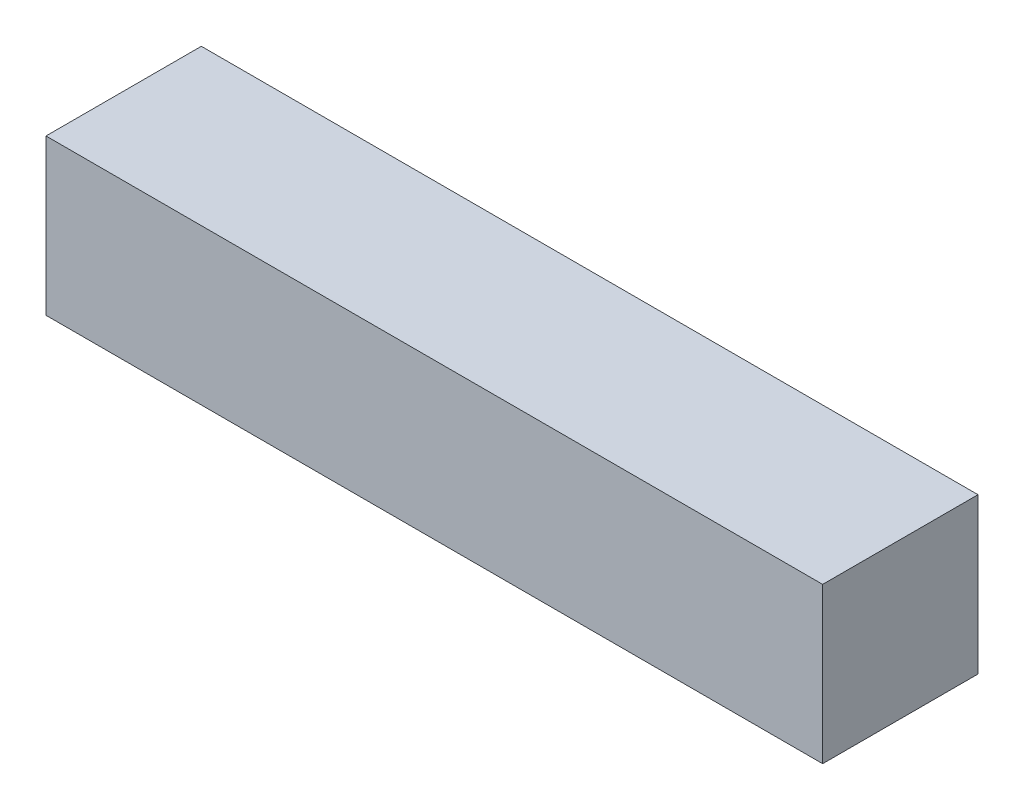
ISO-10303-21;
HEADER;
FILE_DESCRIPTION(('STEP AP214'),'2;1');
FILE_NAME('part.step','',(''),(''),'','','');
FILE_SCHEMA(('AUTOMOTIVE_DESIGN { 1 0 10303 214 1 1 1 1 }'));
ENDSEC;
DATA;
#1=APPLICATION_CONTEXT('core data for automotive mechanical design processes');
#2=APPLICATION_PROTOCOL_DEFINITION('international standard','automotive_design',2000,#1);
#3=PRODUCT_CONTEXT('',#1,'mechanical');
#4=PRODUCT('Part','Part','',(#3));
#5=PRODUCT_RELATED_PRODUCT_CATEGORY('part','',(#4));
#6=PRODUCT_DEFINITION_FORMATION('','',#4);
#7=PRODUCT_DEFINITION_CONTEXT('part definition',#1,'design');
#8=PRODUCT_DEFINITION('design','',#6,#7);
#9=PRODUCT_DEFINITION_SHAPE('','',#8);
#10=(LENGTH_UNIT() NAMED_UNIT(*) SI_UNIT(.MILLI.,.METRE.));
#11=(NAMED_UNIT(*) PLANE_ANGLE_UNIT() SI_UNIT($,.RADIAN.));
#12=(NAMED_UNIT(*) SI_UNIT($,.STERADIAN.) SOLID_ANGLE_UNIT());
#13=UNCERTAINTY_MEASURE_WITH_UNIT(LENGTH_MEASURE(1.E-05),#10,'distance_accuracy_value','');
#14=(GEOMETRIC_REPRESENTATION_CONTEXT(3) GLOBAL_UNCERTAINTY_ASSIGNED_CONTEXT((#13)) GLOBAL_UNIT_ASSIGNED_CONTEXT((#10,
#11,#12)) REPRESENTATION_CONTEXT('',''));
#15=CARTESIAN_POINT('',(0.,0.,0.));
#16=DIRECTION('',(0.,0.,1.));
#17=DIRECTION('',(1.,0.,0.));
#18=AXIS2_PLACEMENT_3D('',#15,#16,#17);
#19=CARTESIAN_POINT('',(10.,0.,0.));
#20=DIRECTION('',(0.,0.,-1.));
#21=DIRECTION('',(-1.,0.,0.));
#22=AXIS2_PLACEMENT_3D('',#19,#20,#21);
#23=PLANE('',#22);
#24=DIRECTION('',(0.,-1.,0.));
#25=VECTOR('',#24,1.);
#26=CARTESIAN_POINT('',(0.,0.,0.));
#27=LINE('',#26,#25);
#28=CARTESIAN_POINT('',(0.,2.,0.));
#29=VERTEX_POINT('',#28);
#30=CARTESIAN_POINT('',(0.,0.,0.));
#31=VERTEX_POINT('',#30);
#32=EDGE_CURVE('E99',#29,#31,#27,.T.);
#33=ORIENTED_EDGE('',*,*,#32,.T.);
#34=DIRECTION('',(-1.,0.,0.));
#35=VECTOR('',#34,1.);
#36=CARTESIAN_POINT('',(10.,0.,0.));
#37=LINE('',#36,#35);
#38=CARTESIAN_POINT('',(10.,0.,0.));
#39=VERTEX_POINT('',#38);
#40=EDGE_CURVE('E11',#39,#31,#37,.T.);
#41=ORIENTED_EDGE('',*,*,#40,.F.);
#42=DIRECTION('',(0.,-1.,0.));
#43=VECTOR('',#42,1.);
#44=CARTESIAN_POINT('',(10.,0.,0.));
#45=LINE('',#44,#43);
#46=CARTESIAN_POINT('',(10.,2.,0.));
#47=VERTEX_POINT('',#46);
#48=EDGE_CURVE('E87',#47,#39,#45,.T.);
#49=ORIENTED_EDGE('',*,*,#48,.F.);
#50=DIRECTION('',(-1.,0.,0.));
#51=VECTOR('',#50,1.);
#52=CARTESIAN_POINT('',(10.,2.,0.));
#53=LINE('',#52,#51);
#54=EDGE_CURVE('E95',#47,#29,#53,.T.);
#55=ORIENTED_EDGE('',*,*,#54,.T.);
#56=EDGE_LOOP('',(#33,#41,#49,#55));
#57=FACE_BOUND('',#56,.T.);
#58=ADVANCED_FACE('F36',(#57),#23,.F.);
#59=CARTESIAN_POINT('',(10.,0.,0.));
#60=DIRECTION('',(0.,1.,0.));
#61=DIRECTION('',(0.,0.,1.));
#62=AXIS2_PLACEMENT_3D('',#59,#60,#61);
#63=PLANE('',#62);
#64=DIRECTION('',(0.,0.,-1.));
#65=VECTOR('',#64,1.);
#66=CARTESIAN_POINT('',(0.,0.,0.));
#67=LINE('',#66,#65);
#68=CARTESIAN_POINT('',(0.,0.,-2.));
#69=VERTEX_POINT('',#68);
#70=EDGE_CURVE('E91',#31,#69,#67,.T.);
#71=ORIENTED_EDGE('',*,*,#70,.T.);
#72=DIRECTION('',(-1.,0.,0.));
#73=VECTOR('',#72,1.);
#74=CARTESIAN_POINT('',(10.,0.,-2.));
#75=LINE('',#74,#73);
#76=CARTESIAN_POINT('',(10.,0.,-2.));
#77=VERTEX_POINT('',#76);
#78=EDGE_CURVE('E44',#77,#69,#75,.T.);
#79=ORIENTED_EDGE('',*,*,#78,.F.);
#80=DIRECTION('',(0.,0.,-1.));
#81=VECTOR('',#80,1.);
#82=CARTESIAN_POINT('',(10.,0.,0.));
#83=LINE('',#82,#81);
#84=EDGE_CURVE('E82',#39,#77,#83,.T.);
#85=ORIENTED_EDGE('',*,*,#84,.F.);
#86=ORIENTED_EDGE('',*,*,#40,.T.);
#87=EDGE_LOOP('',(#71,#79,#85,#86));
#88=FACE_BOUND('',#87,.T.);
#89=ADVANCED_FACE('F90',(#88),#63,.F.);
#90=CARTESIAN_POINT('',(10.,0.,-2.));
#91=DIRECTION('',(0.,0.,1.));
#92=DIRECTION('',(1.,0.,0.));
#93=AXIS2_PLACEMENT_3D('',#90,#91,#92);
#94=PLANE('',#93);
#95=DIRECTION('',(0.,1.,0.));
#96=VECTOR('',#95,1.);
#97=CARTESIAN_POINT('',(0.,0.,-2.));
#98=LINE('',#97,#96);
#99=CARTESIAN_POINT('',(0.,2.,-2.));
#100=VERTEX_POINT('',#99);
#101=EDGE_CURVE('E69',#69,#100,#98,.T.);
#102=ORIENTED_EDGE('',*,*,#101,.T.);
#103=DIRECTION('',(-1.,0.,0.));
#104=VECTOR('',#103,1.);
#105=CARTESIAN_POINT('',(10.,2.,-2.));
#106=LINE('',#105,#104);
#107=CARTESIAN_POINT('',(10.,2.,-2.));
#108=VERTEX_POINT('',#107);
#109=EDGE_CURVE('E92',#108,#100,#106,.T.);
#110=ORIENTED_EDGE('',*,*,#109,.F.);
#111=DIRECTION('',(0.,1.,0.));
#112=VECTOR('',#111,1.);
#113=CARTESIAN_POINT('',(10.,0.,-2.));
#114=LINE('',#113,#112);
#115=EDGE_CURVE('E85',#77,#108,#114,.T.);
#116=ORIENTED_EDGE('',*,*,#115,.F.);
#117=ORIENTED_EDGE('',*,*,#78,.T.);
#118=EDGE_LOOP('',(#102,#110,#116,#117));
#119=FACE_BOUND('',#118,.T.);
#120=ADVANCED_FACE('F93',(#119),#94,.F.);
#121=CARTESIAN_POINT('',(10.,2.,0.));
#122=DIRECTION('',(0.,-1.,0.));
#123=DIRECTION('',(0.,0.,-1.));
#124=AXIS2_PLACEMENT_3D('',#121,#122,#123);
#125=PLANE('',#124);
#126=DIRECTION('',(0.,0.,1.));
#127=VECTOR('',#126,1.);
#128=CARTESIAN_POINT('',(0.,2.,0.));
#129=LINE('',#128,#127);
#130=EDGE_CURVE('E75',#100,#29,#129,.T.);
#131=ORIENTED_EDGE('',*,*,#130,.T.);
#132=ORIENTED_EDGE('',*,*,#54,.F.);
#133=DIRECTION('',(0.,0.,1.));
#134=VECTOR('',#133,1.);
#135=CARTESIAN_POINT('',(10.,2.,0.));
#136=LINE('',#135,#134);
#137=EDGE_CURVE('E52',#108,#47,#136,.T.);
#138=ORIENTED_EDGE('',*,*,#137,.F.);
#139=ORIENTED_EDGE('',*,*,#109,.T.);
#140=EDGE_LOOP('',(#131,#132,#138,#139));
#141=FACE_BOUND('',#140,.T.);
#142=ADVANCED_FACE('F106',(#141),#125,.F.);
#143=CARTESIAN_POINT('',(10.,0.,0.));
#144=DIRECTION('',(-1.,0.,0.));
#145=DIRECTION('',(0.,0.,1.));
#146=AXIS2_PLACEMENT_3D('',#143,#144,#145);
#147=PLANE('',#146);
#148=ORIENTED_EDGE('',*,*,#48,.T.);
#149=ORIENTED_EDGE('',*,*,#84,.T.);
#150=ORIENTED_EDGE('',*,*,#115,.T.);
#151=ORIENTED_EDGE('',*,*,#137,.T.);
#152=EDGE_LOOP('',(#148,#149,#150,#151));
#153=FACE_BOUND('',#152,.T.);
#154=ADVANCED_FACE('F83',(#153),#147,.F.);
#155=CARTESIAN_POINT('',(0.,0.,0.));
#156=DIRECTION('',(-1.,0.,0.));
#157=DIRECTION('',(0.,0.,1.));
#158=AXIS2_PLACEMENT_3D('',#155,#156,#157);
#159=PLANE('',#158);
#160=ORIENTED_EDGE('',*,*,#32,.F.);
#161=ORIENTED_EDGE('',*,*,#130,.F.);
#162=ORIENTED_EDGE('',*,*,#101,.F.);
#163=ORIENTED_EDGE('',*,*,#70,.F.);
#164=EDGE_LOOP('',(#160,#161,#162,#163));
#165=FACE_BOUND('',#164,.T.);
#166=ADVANCED_FACE('F109',(#165),#159,.T.);
#167=CLOSED_SHELL('',(#58,#89,#120,#142,#154,#166));
#168=MANIFOLD_SOLID_BREP('B2',#167);
#169=ADVANCED_BREP_SHAPE_REPRESENTATION('',(#18,#168),#14);
#170=SHAPE_DEFINITION_REPRESENTATION(#9,#169);
ENDSEC;
END-ISO-10303-21;
